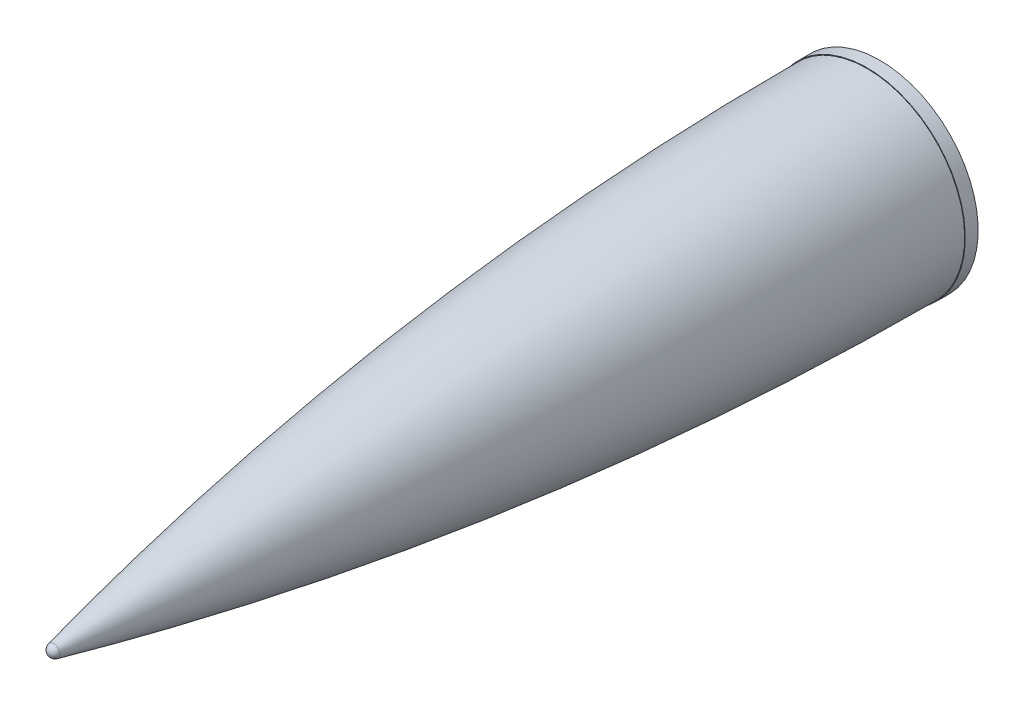
ISO-10303-21;
HEADER;
FILE_DESCRIPTION(('STEP AP214'),'2;1');
FILE_NAME('part.step','',(''),(''),'','','');
FILE_SCHEMA(('AUTOMOTIVE_DESIGN { 1 0 10303 214 1 1 1 1 }'));
ENDSEC;
DATA;
#1=APPLICATION_CONTEXT('core data for automotive mechanical design processes');
#2=APPLICATION_PROTOCOL_DEFINITION('international standard','automotive_design',2000,#1);
#3=PRODUCT_CONTEXT('',#1,'mechanical');
#4=PRODUCT('Part','Part','',(#3));
#5=PRODUCT_RELATED_PRODUCT_CATEGORY('part','',(#4));
#6=PRODUCT_DEFINITION_FORMATION('','',#4);
#7=PRODUCT_DEFINITION_CONTEXT('part definition',#1,'design');
#8=PRODUCT_DEFINITION('design','',#6,#7);
#9=PRODUCT_DEFINITION_SHAPE('','',#8);
#10=(LENGTH_UNIT() NAMED_UNIT(*) SI_UNIT(.MILLI.,.METRE.));
#11=(NAMED_UNIT(*) PLANE_ANGLE_UNIT() SI_UNIT($,.RADIAN.));
#12=(NAMED_UNIT(*) SI_UNIT($,.STERADIAN.) SOLID_ANGLE_UNIT());
#13=UNCERTAINTY_MEASURE_WITH_UNIT(LENGTH_MEASURE(1.E-05),#10,'distance_accuracy_value','');
#14=(GEOMETRIC_REPRESENTATION_CONTEXT(3) GLOBAL_UNCERTAINTY_ASSIGNED_CONTEXT((#13)) GLOBAL_UNIT_ASSIGNED_CONTEXT((#10,
#11,#12)) REPRESENTATION_CONTEXT('',''));
#15=CARTESIAN_POINT('',(0.,0.,0.));
#16=DIRECTION('',(0.,0.,1.));
#17=DIRECTION('',(1.,0.,0.));
#18=AXIS2_PLACEMENT_3D('',#15,#16,#17);
#19=CARTESIAN_POINT('',(0.,-2.37065469647985E-11,4067.73873053018));
#20=DIRECTION('',(0.,0.,1.));
#21=DIRECTION('',(1.,0.,0.));
#22=AXIS2_PLACEMENT_3D('',#19,#20,#21);
#23=PLANE('',#22);
#24=CARTESIAN_POINT('',(0.,0.,4067.73873053018));
#25=DIRECTION('',(0.,0.,-1.));
#26=DIRECTION('',(-1.,0.,0.));
#27=AXIS2_PLACEMENT_3D('',#24,#25,#26);
#28=CIRCLE('',#27,152.4);
#29=CARTESIAN_POINT('',(-152.4,0.,4067.73873053018));
#30=VERTEX_POINT('',#29);
#31=EDGE_CURVE('E51',#30,#30,#28,.T.);
#32=ORIENTED_EDGE('',*,*,#31,.T.);
#33=EDGE_LOOP('',(#32));
#34=FACE_BOUND('',#33,.T.);
#35=ADVANCED_FACE('F42',(#34),#23,.F.);
#36=CARTESIAN_POINT('',(0.,0.,4067.73873053018));
#37=DIRECTION('',(0.,0.,-1.));
#38=DIRECTION('',(-1.,0.,0.));
#39=AXIS2_PLACEMENT_3D('',#36,#37,#38);
#40=CYLINDRICAL_SURFACE('',#39,152.4);
#41=CARTESIAN_POINT('',(0.,0.,4087.73873053018));
#42=DIRECTION('',(0.,0.,-1.));
#43=DIRECTION('',(-1.,0.,0.));
#44=AXIS2_PLACEMENT_3D('',#41,#42,#43);
#45=CIRCLE('',#44,152.4);
#46=CARTESIAN_POINT('',(-152.4,0.,4087.73873053018));
#47=VERTEX_POINT('',#46);
#48=EDGE_CURVE('E54',#47,#47,#45,.T.);
#49=ORIENTED_EDGE('',*,*,#48,.T.);
#50=EDGE_LOOP('',(#49));
#51=FACE_BOUND('',#50,.T.);
#52=ORIENTED_EDGE('',*,*,#31,.F.);
#53=EDGE_LOOP('',(#52));
#54=FACE_BOUND('',#53,.T.);
#55=ADVANCED_FACE('F87',(#51,#54),#40,.T.);
#56=CARTESIAN_POINT('',(0.,-2.38231058125282E-11,4087.73873053018));
#57=DIRECTION('',(0.,0.,1.));
#58=DIRECTION('',(1.,0.,0.));
#59=AXIS2_PLACEMENT_3D('',#56,#57,#58);
#60=PLANE('',#59);
#61=CARTESIAN_POINT('',(0.,0.,4087.73873053018));
#62=DIRECTION('',(0.,0.,-1.));
#63=DIRECTION('',(0.,1.,0.));
#64=AXIS2_PLACEMENT_3D('',#61,#62,#63);
#65=CIRCLE('',#64,151.4);
#66=CARTESIAN_POINT('',(0.,151.4,4087.73873053018));
#67=VERTEX_POINT('',#66);
#68=EDGE_CURVE('E56',#67,#67,#65,.T.);
#69=ORIENTED_EDGE('',*,*,#68,.T.);
#70=EDGE_LOOP('',(#69));
#71=FACE_BOUND('',#70,.T.);
#72=ORIENTED_EDGE('',*,*,#48,.F.);
#73=EDGE_LOOP('',(#72));
#74=FACE_BOUND('',#73,.T.);
#75=ADVANCED_FACE('F86',(#71,#74),#60,.T.);
#76=CARTESIAN_POINT('',(0.,0.,5347.73873053018));
#77=DIRECTION('',(0.,0.,-1.));
#78=DIRECTION('',(0.,1.,0.));
#79=AXIS2_PLACEMENT_3D('',#76,#77,#78);
#80=SPHERICAL_SURFACE('',#79,9.99999999999956);
#81=CARTESIAN_POINT('',(0.,0.,5349.95526038079));
#82=DIRECTION('',(0.,0.,-1.));
#83=DIRECTION('',(0.,1.,0.));
#84=AXIS2_PLACEMENT_3D('',#81,#82,#83);
#85=CIRCLE('',#84,9.75125609454253);
#86=CARTESIAN_POINT('',(0.,9.75125609454253,5349.95526038079));
#87=VERTEX_POINT('',#86);
#88=EDGE_CURVE('E65',#87,#87,#85,.T.);
#89=ORIENTED_EDGE('',*,*,#88,.F.);
#90=EDGE_LOOP('',(#89));
#91=FACE_BOUND('',#90,.T.);
#92=ADVANCED_FACE('F88',(#91),#80,.T.);
#93=CARTESIAN_POINT('',(0.,0.,4087.73873053018));
#94=DIRECTION('',(0.,0.,-1.));
#95=DIRECTION('',(0.,1.,0.));
#96=AXIS2_PLACEMENT_3D('',#93,#94,#95);
#97=DEGENERATE_TOROIDAL_SURFACE('',#96,5543.16138613862,5694.56138613862,.F.);
#98=ORIENTED_EDGE('',*,*,#68,.F.);
#99=EDGE_LOOP('',(#98));
#100=FACE_BOUND('',#99,.T.);
#101=ORIENTED_EDGE('',*,*,#88,.T.);
#102=EDGE_LOOP('',(#101));
#103=FACE_BOUND('',#102,.T.);
#104=ADVANCED_FACE('F81',(#100,#103),#97,.F.);
#105=CLOSED_SHELL('',(#35,#55,#75,#92,#104));
#106=CARTESIAN_POINT('',(0.,0.,4087.73873053018));
#107=DIRECTION('',(0.,0.,-1.));
#108=DIRECTION('',(0.,1.,0.));
#109=AXIS2_PLACEMENT_3D('',#106,#107,#108);
#110=DEGENERATE_TOROIDAL_SURFACE('',#109,5543.16138613862,5693.56138613862,.F.);
#111=CARTESIAN_POINT('',(0.,0.,4087.73873053018));
#112=DIRECTION('',(0.,0.,1.));
#113=DIRECTION('',(1.,0.,0.));
#114=AXIS2_PLACEMENT_3D('',#111,#112,#113);
#115=CIRCLE('',#114,150.399999999999);
#116=CARTESIAN_POINT('',(150.399999999999,0.,4087.73873053018));
#117=VERTEX_POINT('',#116);
#118=EDGE_CURVE('E10',#117,#117,#115,.F.);
#119=ORIENTED_EDGE('',*,*,#118,.T.);
#120=EDGE_LOOP('',(#119));
#121=FACE_BOUND('',#120,.T.);
#122=CARTESIAN_POINT('',(0.,0.,5349.73360739573));
#123=DIRECTION('',(0.,0.,-1.));
#124=DIRECTION('',(0.,1.,0.));
#125=AXIS2_PLACEMENT_3D('',#122,#123,#124);
#126=CIRCLE('',#125,8.77613048508774);
#127=CARTESIAN_POINT('',(0.,8.77613048508774,5349.73360739573));
#128=VERTEX_POINT('',#127);
#129=EDGE_CURVE('E66',#128,#128,#126,.T.);
#130=ORIENTED_EDGE('',*,*,#129,.F.);
#131=EDGE_LOOP('',(#130));
#132=FACE_BOUND('',#131,.T.);
#133=ADVANCED_FACE('F74',(#121,#132),#110,.T.);
#134=CARTESIAN_POINT('',(0.,0.,5347.73873053018));
#135=DIRECTION('',(0.,0.,-1.));
#136=DIRECTION('',(0.,1.,0.));
#137=AXIS2_PLACEMENT_3D('',#134,#135,#136);
#138=SPHERICAL_SURFACE('',#137,8.99999999999956);
#139=ORIENTED_EDGE('',*,*,#129,.T.);
#140=EDGE_LOOP('',(#139));
#141=FACE_BOUND('',#140,.T.);
#142=ADVANCED_FACE('F71',(#141),#138,.F.);
#143=ORIENTED_EDGE('',*,*,#118,.F.);
#144=EDGE_LOOP('',(#143));
#145=FACE_BOUND('',#144,.T.);
#146=ADVANCED_FACE('F83',(#145),#60,.T.);
#147=CLOSED_SHELL('',(#133,#142,#146));
#148=ORIENTED_CLOSED_SHELL('',*,#147,.T.);
#149=BREP_WITH_VOIDS('B2',#105,(#148));
#150=ADVANCED_BREP_SHAPE_REPRESENTATION('',(#18,#149),#14);
#151=SHAPE_DEFINITION_REPRESENTATION(#9,#150);
ENDSEC;
END-ISO-10303-21;
